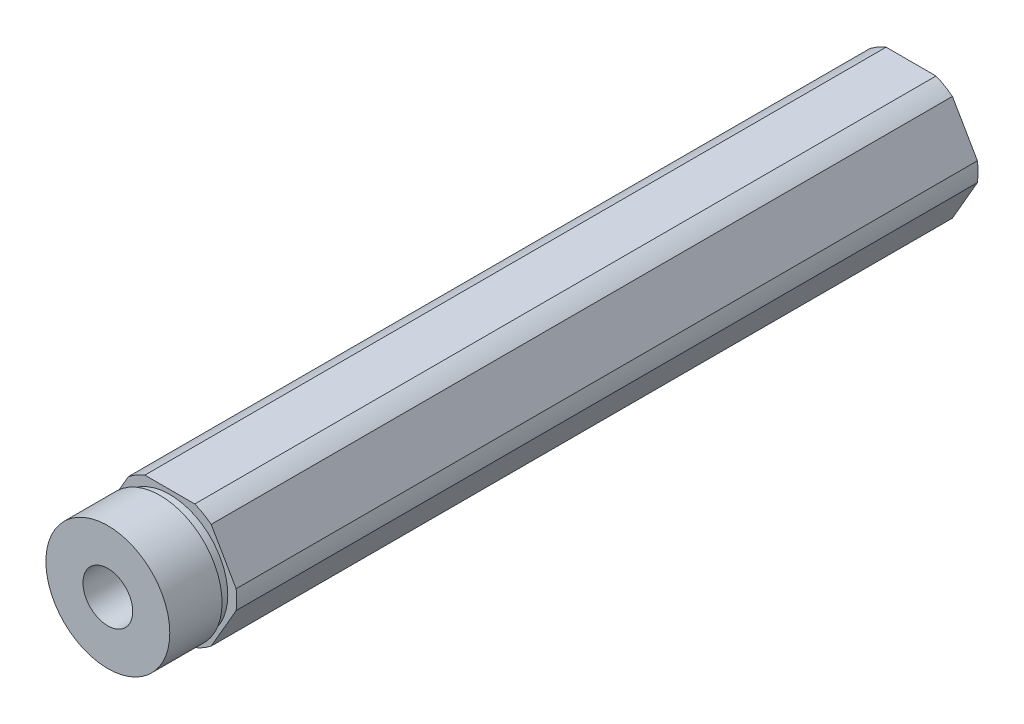
ISO-10303-21;
HEADER;
FILE_DESCRIPTION(('STEP AP214'),'2;1');
FILE_NAME('part.step','',(''),(''),'','','');
FILE_SCHEMA(('AUTOMOTIVE_DESIGN { 1 0 10303 214 1 1 1 1 }'));
ENDSEC;
DATA;
#1=APPLICATION_CONTEXT('core data for automotive mechanical design processes');
#2=APPLICATION_PROTOCOL_DEFINITION('international standard','automotive_design',2000,#1);
#3=PRODUCT_CONTEXT('',#1,'mechanical');
#4=PRODUCT('Part','Part','',(#3));
#5=PRODUCT_RELATED_PRODUCT_CATEGORY('part','',(#4));
#6=PRODUCT_DEFINITION_FORMATION('','',#4);
#7=PRODUCT_DEFINITION_CONTEXT('part definition',#1,'design');
#8=PRODUCT_DEFINITION('design','',#6,#7);
#9=PRODUCT_DEFINITION_SHAPE('','',#8);
#10=(LENGTH_UNIT() NAMED_UNIT(*) SI_UNIT(.MILLI.,.METRE.));
#11=(NAMED_UNIT(*) PLANE_ANGLE_UNIT() SI_UNIT($,.RADIAN.));
#12=(NAMED_UNIT(*) SI_UNIT($,.STERADIAN.) SOLID_ANGLE_UNIT());
#13=UNCERTAINTY_MEASURE_WITH_UNIT(LENGTH_MEASURE(1.E-05),#10,'distance_accuracy_value','');
#14=(GEOMETRIC_REPRESENTATION_CONTEXT(3) GLOBAL_UNCERTAINTY_ASSIGNED_CONTEXT((#13)) GLOBAL_UNIT_ASSIGNED_CONTEXT((#10,
#11,#12)) REPRESENTATION_CONTEXT('',''));
#15=CARTESIAN_POINT('',(0.,0.,0.));
#16=DIRECTION('',(0.,0.,1.));
#17=DIRECTION('',(1.,0.,0.));
#18=AXIS2_PLACEMENT_3D('',#15,#16,#17);
#19=CARTESIAN_POINT('',(0.,0.,-228.6));
#20=DIRECTION('',(0.,0.,1.));
#21=DIRECTION('',(1.,0.,0.));
#22=AXIS2_PLACEMENT_3D('',#19,#20,#21);
#23=CYLINDRICAL_SURFACE('',#22,6.87);
#24=DIRECTION('',(0.,0.,1.));
#25=VECTOR('',#24,1.);
#26=CARTESIAN_POINT('',(6.80102150534208,0.97108520937895,228.6));
#27=LINE('',#26,#25);
#28=CARTESIAN_POINT('',(6.80102150534208,0.971085209378948,-228.6));
#29=VERTEX_POINT('',#28);
#30=CARTESIAN_POINT('',(6.80102150534208,0.971085209378948,-152.62225));
#31=VERTEX_POINT('',#30);
#32=EDGE_CURVE('E181',#29,#31,#27,.T.);
#33=ORIENTED_EDGE('',*,*,#32,.T.);
#34=CARTESIAN_POINT('',(0.,0.,-152.62225));
#35=DIRECTION('',(0.,0.,1.));
#36=DIRECTION('',(1.,0.,0.));
#37=AXIS2_PLACEMENT_3D('',#34,#35,#36);
#38=CIRCLE('',#37,6.87);
#39=CARTESIAN_POINT('',(6.80102150534208,-0.971085209378954,-152.62225));
#40=VERTEX_POINT('',#39);
#41=EDGE_CURVE('E124',#31,#40,#38,.F.);
#42=ORIENTED_EDGE('',*,*,#41,.T.);
#43=DIRECTION('',(0.,0.,1.));
#44=VECTOR('',#43,1.);
#45=CARTESIAN_POINT('',(6.80102150534208,-0.971085209378955,228.6));
#46=LINE('',#45,#44);
#47=CARTESIAN_POINT('',(6.80102150534208,-0.971085209378953,-228.6));
#48=VERTEX_POINT('',#47);
#49=EDGE_CURVE('E118',#40,#48,#46,.F.);
#50=ORIENTED_EDGE('',*,*,#49,.T.);
#51=CARTESIAN_POINT('',(0.,0.,-228.6));
#52=DIRECTION('',(0.,0.,1.));
#53=DIRECTION('',(1.,0.,0.));
#54=AXIS2_PLACEMENT_3D('',#51,#52,#53);
#55=CIRCLE('',#54,6.87);
#56=EDGE_CURVE('E121',#48,#29,#55,.T.);
#57=ORIENTED_EDGE('',*,*,#56,.T.);
#58=EDGE_LOOP('',(#33,#42,#50,#57));
#59=FACE_BOUND('',#58,.T.);
#60=ADVANCED_FACE('F43',(#59),#23,.T.);
#61=CARTESIAN_POINT('',(3.68083890619154,6.3754,228.6));
#62=DIRECTION('',(0.,-1.,0.));
#63=DIRECTION('',(1.,0.,0.));
#64=AXIS2_PLACEMENT_3D('',#61,#62,#63);
#65=PLANE('',#64);
#66=DIRECTION('',(-1.,0.,0.));
#67=VECTOR('',#66,1.);
#68=CARTESIAN_POINT('',(3.68083890619154,6.3754,-152.62225));
#69=LINE('',#68,#67);
#70=CARTESIAN_POINT('',(2.55952629210953,6.37540000000001,-152.62225));
#71=VERTEX_POINT('',#70);
#72=CARTESIAN_POINT('',(-2.55952629210953,6.3754,-152.62225));
#73=VERTEX_POINT('',#72);
#74=EDGE_CURVE('E300',#71,#73,#69,.T.);
#75=ORIENTED_EDGE('',*,*,#74,.F.);
#76=DIRECTION('',(0.,0.,1.));
#77=VECTOR('',#76,1.);
#78=CARTESIAN_POINT('',(2.55952629210953,6.37540000000001,-228.6));
#79=LINE('',#78,#77);
#80=CARTESIAN_POINT('',(2.55952629210953,6.37540000000001,-228.6));
#81=VERTEX_POINT('',#80);
#82=EDGE_CURVE('E178',#81,#71,#79,.T.);
#83=ORIENTED_EDGE('',*,*,#82,.F.);
#84=DIRECTION('',(1.,0.,0.));
#85=VECTOR('',#84,1.);
#86=CARTESIAN_POINT('',(0.,6.3754,-228.6));
#87=LINE('',#86,#85);
#88=CARTESIAN_POINT('',(-2.55952629210953,6.37540000000001,-228.6));
#89=VERTEX_POINT('',#88);
#90=EDGE_CURVE('E174',#81,#89,#87,.F.);
#91=ORIENTED_EDGE('',*,*,#90,.T.);
#92=DIRECTION('',(0.,0.,1.));
#93=VECTOR('',#92,1.);
#94=CARTESIAN_POINT('',(-2.55952629210953,6.37540000000001,-228.6));
#95=LINE('',#94,#93);
#96=EDGE_CURVE('E143',#73,#89,#95,.F.);
#97=ORIENTED_EDGE('',*,*,#96,.F.);
#98=EDGE_LOOP('',(#75,#83,#91,#97));
#99=FACE_BOUND('',#98,.T.);
#100=ADVANCED_FACE('F247',(#99),#65,.F.);
#101=CARTESIAN_POINT('',(0.,0.,-228.6));
#102=DIRECTION('',(0.,0.,1.));
#103=DIRECTION('',(1.,0.,0.));
#104=AXIS2_PLACEMENT_3D('',#101,#102,#103);
#105=CYLINDRICAL_SURFACE('',#104,6.87);
#106=DIRECTION('',(0.,0.,1.));
#107=VECTOR('',#106,1.);
#108=CARTESIAN_POINT('',(-4.24149521323255,5.40431479062104,228.6));
#109=LINE('',#108,#107);
#110=CARTESIAN_POINT('',(-4.24149521323255,5.40431479062105,-228.6));
#111=VERTEX_POINT('',#110);
#112=CARTESIAN_POINT('',(-4.24149521323255,5.40431479062104,-152.62225));
#113=VERTEX_POINT('',#112);
#114=EDGE_CURVE('E204',#111,#113,#109,.T.);
#115=ORIENTED_EDGE('',*,*,#114,.T.);
#116=CARTESIAN_POINT('',(0.,0.,-152.62225));
#117=DIRECTION('',(0.,0.,1.));
#118=DIRECTION('',(1.,0.,0.));
#119=AXIS2_PLACEMENT_3D('',#116,#117,#118);
#120=CIRCLE('',#119,6.87);
#121=EDGE_CURVE('E144',#113,#73,#120,.F.);
#122=ORIENTED_EDGE('',*,*,#121,.T.);
#123=ORIENTED_EDGE('',*,*,#96,.T.);
#124=CARTESIAN_POINT('',(0.,0.,-228.6));
#125=DIRECTION('',(0.,0.,1.));
#126=DIRECTION('',(1.,0.,0.));
#127=AXIS2_PLACEMENT_3D('',#124,#125,#126);
#128=CIRCLE('',#127,6.87);
#129=EDGE_CURVE('E173',#89,#111,#128,.T.);
#130=ORIENTED_EDGE('',*,*,#129,.T.);
#131=EDGE_LOOP('',(#115,#122,#123,#130));
#132=FACE_BOUND('',#131,.T.);
#133=ADVANCED_FACE('F251',(#132),#105,.T.);
#134=CARTESIAN_POINT('',(-3.68083890619154,6.3754,228.6));
#135=DIRECTION('',(0.866025403784439,-0.5,0.));
#136=DIRECTION('',(0.5,0.866025403784439,0.));
#137=AXIS2_PLACEMENT_3D('',#134,#135,#136);
#138=PLANE('',#137);
#139=DIRECTION('',(-0.5,-0.866025403784439,0.));
#140=VECTOR('',#139,1.);
#141=CARTESIAN_POINT('',(-3.68083890619154,6.3754,-152.62225));
#142=LINE('',#141,#140);
#143=CARTESIAN_POINT('',(-6.80102150534208,0.971085209378959,-152.62225));
#144=VERTEX_POINT('',#143);
#145=EDGE_CURVE('E337',#113,#144,#142,.T.);
#146=ORIENTED_EDGE('',*,*,#145,.F.);
#147=ORIENTED_EDGE('',*,*,#114,.F.);
#148=DIRECTION('',(-0.5,-0.866025403784439,0.));
#149=VECTOR('',#148,1.);
#150=CARTESIAN_POINT('',(-4.24149521323255,5.40431479062104,-228.6));
#151=LINE('',#150,#149);
#152=CARTESIAN_POINT('',(-6.80102150534208,0.971085209378961,-228.6));
#153=VERTEX_POINT('',#152);
#154=EDGE_CURVE('E169',#111,#153,#151,.T.);
#155=ORIENTED_EDGE('',*,*,#154,.T.);
#156=DIRECTION('',(0.,0.,1.));
#157=VECTOR('',#156,1.);
#158=CARTESIAN_POINT('',(-6.80102150534208,0.971085209378959,-228.6));
#159=LINE('',#158,#157);
#160=EDGE_CURVE('E202',#144,#153,#159,.F.);
#161=ORIENTED_EDGE('',*,*,#160,.F.);
#162=EDGE_LOOP('',(#146,#147,#155,#161));
#163=FACE_BOUND('',#162,.T.);
#164=ADVANCED_FACE('F256',(#163),#138,.F.);
#165=CARTESIAN_POINT('',(0.,0.,-228.6));
#166=DIRECTION('',(0.,0.,1.));
#167=DIRECTION('',(1.,0.,0.));
#168=AXIS2_PLACEMENT_3D('',#165,#166,#167);
#169=CYLINDRICAL_SURFACE('',#168,6.87);
#170=DIRECTION('',(0.,0.,1.));
#171=VECTOR('',#170,1.);
#172=CARTESIAN_POINT('',(-6.80102150534208,-0.971085209378956,228.6));
#173=LINE('',#172,#171);
#174=CARTESIAN_POINT('',(-6.80102150534208,-0.971085209378956,-228.6));
#175=VERTEX_POINT('',#174);
#176=CARTESIAN_POINT('',(-6.80102150534208,-0.971085209378956,-152.62225));
#177=VERTEX_POINT('',#176);
#178=EDGE_CURVE('E198',#175,#177,#173,.T.);
#179=ORIENTED_EDGE('',*,*,#178,.T.);
#180=CARTESIAN_POINT('',(0.,0.,-152.62225));
#181=DIRECTION('',(0.,0.,1.));
#182=DIRECTION('',(1.,0.,0.));
#183=AXIS2_PLACEMENT_3D('',#180,#181,#182);
#184=CIRCLE('',#183,6.87);
#185=EDGE_CURVE('E333',#177,#144,#184,.F.);
#186=ORIENTED_EDGE('',*,*,#185,.T.);
#187=ORIENTED_EDGE('',*,*,#160,.T.);
#188=CARTESIAN_POINT('',(0.,0.,-228.6));
#189=DIRECTION('',(0.,0.,1.));
#190=DIRECTION('',(1.,0.,0.));
#191=AXIS2_PLACEMENT_3D('',#188,#189,#190);
#192=CIRCLE('',#191,6.87);
#193=EDGE_CURVE('E168',#153,#175,#192,.T.);
#194=ORIENTED_EDGE('',*,*,#193,.T.);
#195=EDGE_LOOP('',(#179,#186,#187,#194));
#196=FACE_BOUND('',#195,.T.);
#197=ADVANCED_FACE('F263',(#196),#169,.T.);
#198=CARTESIAN_POINT('',(-7.36167781238308,0.,228.6));
#199=DIRECTION('',(0.866025403784439,0.5,0.));
#200=DIRECTION('',(-0.5,0.866025403784439,0.));
#201=AXIS2_PLACEMENT_3D('',#198,#199,#200);
#202=PLANE('',#201);
#203=DIRECTION('',(0.5,-0.866025403784439,0.));
#204=VECTOR('',#203,1.);
#205=CARTESIAN_POINT('',(-7.36167781238308,0.,-152.62225));
#206=LINE('',#205,#204);
#207=CARTESIAN_POINT('',(-4.24149521323255,-5.40431479062105,-152.62225));
#208=VERTEX_POINT('',#207);
#209=EDGE_CURVE('E329',#177,#208,#206,.T.);
#210=ORIENTED_EDGE('',*,*,#209,.F.);
#211=ORIENTED_EDGE('',*,*,#178,.F.);
#212=DIRECTION('',(0.5,-0.866025403784438,0.));
#213=VECTOR('',#212,1.);
#214=CARTESIAN_POINT('',(-6.80102150534208,-0.971085209378956,-228.6));
#215=LINE('',#214,#213);
#216=CARTESIAN_POINT('',(-4.24149521323254,-5.40431479062105,-228.6));
#217=VERTEX_POINT('',#216);
#218=EDGE_CURVE('E165',#175,#217,#215,.T.);
#219=ORIENTED_EDGE('',*,*,#218,.T.);
#220=DIRECTION('',(0.,0.,1.));
#221=VECTOR('',#220,1.);
#222=CARTESIAN_POINT('',(-4.24149521323255,-5.40431479062105,-228.6));
#223=LINE('',#222,#221);
#224=EDGE_CURVE('E195',#208,#217,#223,.F.);
#225=ORIENTED_EDGE('',*,*,#224,.F.);
#226=EDGE_LOOP('',(#210,#211,#219,#225));
#227=FACE_BOUND('',#226,.T.);
#228=ADVANCED_FACE('F267',(#227),#202,.F.);
#229=CARTESIAN_POINT('',(0.,0.,-228.6));
#230=DIRECTION('',(0.,0.,1.));
#231=DIRECTION('',(1.,0.,0.));
#232=AXIS2_PLACEMENT_3D('',#229,#230,#231);
#233=CYLINDRICAL_SURFACE('',#232,6.87);
#234=DIRECTION('',(0.,0.,1.));
#235=VECTOR('',#234,1.);
#236=CARTESIAN_POINT('',(-2.55952629210953,-6.3754,228.6));
#237=LINE('',#236,#235);
#238=CARTESIAN_POINT('',(-2.55952629210953,-6.3754,-228.6));
#239=VERTEX_POINT('',#238);
#240=CARTESIAN_POINT('',(-2.55952629210953,-6.3754,-152.62225));
#241=VERTEX_POINT('',#240);
#242=EDGE_CURVE('E191',#239,#241,#237,.T.);
#243=ORIENTED_EDGE('',*,*,#242,.T.);
#244=CARTESIAN_POINT('',(0.,0.,-152.62225));
#245=DIRECTION('',(0.,0.,1.));
#246=DIRECTION('',(1.,0.,0.));
#247=AXIS2_PLACEMENT_3D('',#244,#245,#246);
#248=CIRCLE('',#247,6.87);
#249=EDGE_CURVE('E325',#241,#208,#248,.F.);
#250=ORIENTED_EDGE('',*,*,#249,.T.);
#251=ORIENTED_EDGE('',*,*,#224,.T.);
#252=CARTESIAN_POINT('',(0.,0.,-228.6));
#253=DIRECTION('',(0.,0.,1.));
#254=DIRECTION('',(1.,0.,0.));
#255=AXIS2_PLACEMENT_3D('',#252,#253,#254);
#256=CIRCLE('',#255,6.87);
#257=EDGE_CURVE('E164',#217,#239,#256,.T.);
#258=ORIENTED_EDGE('',*,*,#257,.T.);
#259=EDGE_LOOP('',(#243,#250,#251,#258));
#260=FACE_BOUND('',#259,.T.);
#261=ADVANCED_FACE('F271',(#260),#233,.T.);
#262=CARTESIAN_POINT('',(-3.68083890619154,-6.3754,228.6));
#263=DIRECTION('',(0.,1.,0.));
#264=DIRECTION('',(0.,0.,1.));
#265=AXIS2_PLACEMENT_3D('',#262,#263,#264);
#266=PLANE('',#265);
#267=DIRECTION('',(1.,0.,0.));
#268=VECTOR('',#267,1.);
#269=CARTESIAN_POINT('',(-3.68083890619154,-6.3754,-152.62225));
#270=LINE('',#269,#268);
#271=CARTESIAN_POINT('',(2.55952629210953,-6.37540000000001,-152.62225));
#272=VERTEX_POINT('',#271);
#273=EDGE_CURVE('E321',#241,#272,#270,.T.);
#274=ORIENTED_EDGE('',*,*,#273,.F.);
#275=ORIENTED_EDGE('',*,*,#242,.F.);
#276=DIRECTION('',(1.,0.,0.));
#277=VECTOR('',#276,1.);
#278=CARTESIAN_POINT('',(0.,-6.3754,-228.6));
#279=LINE('',#278,#277);
#280=CARTESIAN_POINT('',(2.55952629210953,-6.3754,-228.6));
#281=VERTEX_POINT('',#280);
#282=EDGE_CURVE('E157',#239,#281,#279,.T.);
#283=ORIENTED_EDGE('',*,*,#282,.T.);
#284=DIRECTION('',(0.,0.,1.));
#285=VECTOR('',#284,1.);
#286=CARTESIAN_POINT('',(2.55952629210953,-6.3754,-228.6));
#287=LINE('',#286,#285);
#288=EDGE_CURVE('E130',#272,#281,#287,.F.);
#289=ORIENTED_EDGE('',*,*,#288,.F.);
#290=EDGE_LOOP('',(#274,#275,#283,#289));
#291=FACE_BOUND('',#290,.T.);
#292=ADVANCED_FACE('F275',(#291),#266,.F.);
#293=CARTESIAN_POINT('',(0.,0.,-228.6));
#294=DIRECTION('',(0.,0.,1.));
#295=DIRECTION('',(1.,0.,0.));
#296=AXIS2_PLACEMENT_3D('',#293,#294,#295);
#297=CYLINDRICAL_SURFACE('',#296,6.87);
#298=DIRECTION('',(0.,0.,1.));
#299=VECTOR('',#298,1.);
#300=CARTESIAN_POINT('',(4.24149521323254,-5.40431479062105,228.6));
#301=LINE('',#300,#299);
#302=CARTESIAN_POINT('',(4.24149521323254,-5.40431479062105,-228.6));
#303=VERTEX_POINT('',#302);
#304=CARTESIAN_POINT('',(4.24149521323254,-5.40431479062105,-152.62225));
#305=VERTEX_POINT('',#304);
#306=EDGE_CURVE('E129',#303,#305,#301,.T.);
#307=ORIENTED_EDGE('',*,*,#306,.T.);
#308=CARTESIAN_POINT('',(0.,0.,-152.62225));
#309=DIRECTION('',(0.,0.,1.));
#310=DIRECTION('',(1.,0.,0.));
#311=AXIS2_PLACEMENT_3D('',#308,#309,#310);
#312=CIRCLE('',#311,6.87);
#313=EDGE_CURVE('E317',#305,#272,#312,.F.);
#314=ORIENTED_EDGE('',*,*,#313,.T.);
#315=ORIENTED_EDGE('',*,*,#288,.T.);
#316=CARTESIAN_POINT('',(0.,0.,-228.6));
#317=DIRECTION('',(0.,0.,1.));
#318=DIRECTION('',(1.,0.,0.));
#319=AXIS2_PLACEMENT_3D('',#316,#317,#318);
#320=CIRCLE('',#319,6.87);
#321=EDGE_CURVE('E149',#281,#303,#320,.T.);
#322=ORIENTED_EDGE('',*,*,#321,.T.);
#323=EDGE_LOOP('',(#307,#314,#315,#322));
#324=FACE_BOUND('',#323,.T.);
#325=ADVANCED_FACE('F279',(#324),#297,.T.);
#326=CARTESIAN_POINT('',(3.68083890619154,-6.3754,228.6));
#327=DIRECTION('',(-0.866025403784439,0.5,0.));
#328=DIRECTION('',(-0.5,-0.866025403784439,0.));
#329=AXIS2_PLACEMENT_3D('',#326,#327,#328);
#330=PLANE('',#329);
#331=DIRECTION('',(0.5,0.866025403784439,0.));
#332=VECTOR('',#331,1.);
#333=CARTESIAN_POINT('',(3.68083890619154,-6.3754,-152.62225));
#334=LINE('',#333,#332);
#335=EDGE_CURVE('E308',#305,#40,#334,.T.);
#336=ORIENTED_EDGE('',*,*,#335,.F.);
#337=ORIENTED_EDGE('',*,*,#306,.F.);
#338=DIRECTION('',(0.5,0.866025403784439,0.));
#339=VECTOR('',#338,1.);
#340=CARTESIAN_POINT('',(4.24149521323254,-5.40431479062105,-228.6));
#341=LINE('',#340,#339);
#342=EDGE_CURVE('E138',#303,#48,#341,.T.);
#343=ORIENTED_EDGE('',*,*,#342,.T.);
#344=ORIENTED_EDGE('',*,*,#49,.F.);
#345=EDGE_LOOP('',(#336,#337,#343,#344));
#346=FACE_BOUND('',#345,.T.);
#347=ADVANCED_FACE('F146',(#346),#330,.F.);
#348=CARTESIAN_POINT('',(7.36167781238308,0.,228.6));
#349=DIRECTION('',(-0.866025403784439,-0.5,0.));
#350=DIRECTION('',(0.5,-0.866025403784439,0.));
#351=AXIS2_PLACEMENT_3D('',#348,#349,#350);
#352=PLANE('',#351);
#353=DIRECTION('',(-0.5,0.866025403784439,0.));
#354=VECTOR('',#353,1.);
#355=CARTESIAN_POINT('',(7.36167781238308,0.,-152.62225));
#356=LINE('',#355,#354);
#357=CARTESIAN_POINT('',(4.24149521323254,5.40431479062105,-152.62225));
#358=VERTEX_POINT('',#357);
#359=EDGE_CURVE('E61',#31,#358,#356,.T.);
#360=ORIENTED_EDGE('',*,*,#359,.F.);
#361=ORIENTED_EDGE('',*,*,#32,.F.);
#362=DIRECTION('',(-0.5,0.866025403784438,0.));
#363=VECTOR('',#362,1.);
#364=CARTESIAN_POINT('',(6.80102150534208,0.97108520937895,-228.6));
#365=LINE('',#364,#363);
#366=CARTESIAN_POINT('',(4.24149521323254,5.40431479062105,-228.6));
#367=VERTEX_POINT('',#366);
#368=EDGE_CURVE('E141',#29,#367,#365,.T.);
#369=ORIENTED_EDGE('',*,*,#368,.T.);
#370=DIRECTION('',(0.,0.,1.));
#371=VECTOR('',#370,1.);
#372=CARTESIAN_POINT('',(4.24149521323254,5.40431479062105,-228.6));
#373=LINE('',#372,#371);
#374=EDGE_CURVE('E69',#358,#367,#373,.F.);
#375=ORIENTED_EDGE('',*,*,#374,.F.);
#376=EDGE_LOOP('',(#360,#361,#369,#375));
#377=FACE_BOUND('',#376,.T.);
#378=ADVANCED_FACE('F286',(#377),#352,.F.);
#379=CARTESIAN_POINT('',(0.,0.,-228.6));
#380=DIRECTION('',(0.,0.,1.));
#381=DIRECTION('',(1.,0.,0.));
#382=AXIS2_PLACEMENT_3D('',#379,#380,#381);
#383=CYLINDRICAL_SURFACE('',#382,6.87);
#384=ORIENTED_EDGE('',*,*,#82,.T.);
#385=CARTESIAN_POINT('',(0.,0.,-152.62225));
#386=DIRECTION('',(0.,0.,1.));
#387=DIRECTION('',(1.,0.,0.));
#388=AXIS2_PLACEMENT_3D('',#385,#386,#387);
#389=CIRCLE('',#388,6.87);
#390=EDGE_CURVE('E12',#71,#358,#389,.F.);
#391=ORIENTED_EDGE('',*,*,#390,.T.);
#392=ORIENTED_EDGE('',*,*,#374,.T.);
#393=CARTESIAN_POINT('',(0.,0.,-228.6));
#394=DIRECTION('',(0.,0.,1.));
#395=DIRECTION('',(1.,0.,0.));
#396=AXIS2_PLACEMENT_3D('',#393,#394,#395);
#397=CIRCLE('',#396,6.87);
#398=EDGE_CURVE('E154',#367,#81,#397,.T.);
#399=ORIENTED_EDGE('',*,*,#398,.T.);
#400=EDGE_LOOP('',(#384,#391,#392,#399));
#401=FACE_BOUND('',#400,.T.);
#402=ADVANCED_FACE('F243',(#401),#383,.T.);
#403=CARTESIAN_POINT('',(0.,0.,-146.27225));
#404=DIRECTION('',(0.,0.,1.));
#405=DIRECTION('',(1.,0.,0.));
#406=AXIS2_PLACEMENT_3D('',#403,#404,#405);
#407=PLANE('',#406);
#408=CARTESIAN_POINT('',(0.,0.,-146.27225));
#409=DIRECTION('',(0.,0.,1.));
#410=DIRECTION('',(1.,0.,0.));
#411=AXIS2_PLACEMENT_3D('',#408,#409,#410);
#412=CIRCLE('',#411,2.55);
#413=CARTESIAN_POINT('',(2.55,0.,-146.27225));
#414=VERTEX_POINT('',#413);
#415=EDGE_CURVE('E51',#414,#414,#412,.F.);
#416=ORIENTED_EDGE('',*,*,#415,.T.);
#417=EDGE_LOOP('',(#416));
#418=FACE_BOUND('',#417,.T.);
#419=CARTESIAN_POINT('',(0.,0.,-146.27225));
#420=DIRECTION('',(0.,0.,1.));
#421=DIRECTION('',(1.,0.,0.));
#422=AXIS2_PLACEMENT_3D('',#419,#420,#421);
#423=CIRCLE('',#422,6.35);
#424=CARTESIAN_POINT('',(6.35,0.,-146.27225));
#425=VERTEX_POINT('',#424);
#426=EDGE_CURVE('E395',#425,#425,#423,.T.);
#427=ORIENTED_EDGE('',*,*,#426,.T.);
#428=EDGE_LOOP('',(#427));
#429=FACE_BOUND('',#428,.T.);
#430=ADVANCED_FACE('F230',(#418,#429),#407,.T.);
#431=CARTESIAN_POINT('',(0.,0.,-228.6));
#432=DIRECTION('',(0.,0.,1.));
#433=DIRECTION('',(1.,0.,0.));
#434=AXIS2_PLACEMENT_3D('',#431,#432,#433);
#435=CYLINDRICAL_SURFACE('',#434,2.55);
#436=CARTESIAN_POINT('',(0.,0.,-228.6));
#437=DIRECTION('',(0.,0.,1.));
#438=DIRECTION('',(1.,0.,0.));
#439=AXIS2_PLACEMENT_3D('',#436,#437,#438);
#440=CIRCLE('',#439,2.55);
#441=CARTESIAN_POINT('',(2.55,0.,-228.6));
#442=VERTEX_POINT('',#441);
#443=EDGE_CURVE('E210',#442,#442,#440,.T.);
#444=ORIENTED_EDGE('',*,*,#443,.F.);
#445=EDGE_LOOP('',(#444));
#446=FACE_BOUND('',#445,.T.);
#447=ORIENTED_EDGE('',*,*,#415,.F.);
#448=EDGE_LOOP('',(#447));
#449=FACE_BOUND('',#448,.T.);
#450=ADVANCED_FACE('F233',(#446,#449),#435,.F.);
#451=CARTESIAN_POINT('',(0.,0.,-228.6));
#452=DIRECTION('',(0.,0.,1.));
#453=DIRECTION('',(1.,0.,0.));
#454=AXIS2_PLACEMENT_3D('',#451,#452,#453);
#455=PLANE('',#454);
#456=ORIENTED_EDGE('',*,*,#368,.F.);
#457=ORIENTED_EDGE('',*,*,#56,.F.);
#458=ORIENTED_EDGE('',*,*,#342,.F.);
#459=ORIENTED_EDGE('',*,*,#321,.F.);
#460=ORIENTED_EDGE('',*,*,#282,.F.);
#461=ORIENTED_EDGE('',*,*,#257,.F.);
#462=ORIENTED_EDGE('',*,*,#218,.F.);
#463=ORIENTED_EDGE('',*,*,#193,.F.);
#464=ORIENTED_EDGE('',*,*,#154,.F.);
#465=ORIENTED_EDGE('',*,*,#129,.F.);
#466=ORIENTED_EDGE('',*,*,#90,.F.);
#467=ORIENTED_EDGE('',*,*,#398,.F.);
#468=EDGE_LOOP('',(#456,#457,#458,#459,#460,#461,#462,#463,#464,#465,#466,#467));
#469=FACE_BOUND('',#468,.T.);
#470=ORIENTED_EDGE('',*,*,#443,.T.);
#471=EDGE_LOOP('',(#470));
#472=FACE_BOUND('',#471,.T.);
#473=ADVANCED_FACE('F135',(#469,#472),#455,.F.);
#474=CARTESIAN_POINT('',(0.,10.6805397085514,-152.62225));
#475=DIRECTION('',(0.,0.,1.));
#476=DIRECTION('',(1.,0.,0.));
#477=AXIS2_PLACEMENT_3D('',#474,#475,#476);
#478=PLANE('',#477);
#479=ORIENTED_EDGE('',*,*,#145,.T.);
#480=ORIENTED_EDGE('',*,*,#185,.F.);
#481=ORIENTED_EDGE('',*,*,#209,.T.);
#482=ORIENTED_EDGE('',*,*,#249,.F.);
#483=ORIENTED_EDGE('',*,*,#273,.T.);
#484=ORIENTED_EDGE('',*,*,#313,.F.);
#485=ORIENTED_EDGE('',*,*,#335,.T.);
#486=ORIENTED_EDGE('',*,*,#41,.F.);
#487=ORIENTED_EDGE('',*,*,#359,.T.);
#488=ORIENTED_EDGE('',*,*,#390,.F.);
#489=ORIENTED_EDGE('',*,*,#74,.T.);
#490=ORIENTED_EDGE('',*,*,#121,.F.);
#491=EDGE_LOOP('',(#479,#480,#481,#482,#483,#484,#485,#486,#487,#488,#489,#490));
#492=FACE_BOUND('',#491,.T.);
#493=CARTESIAN_POINT('',(0.,0.,-152.62225));
#494=DIRECTION('',(0.,0.,1.));
#495=DIRECTION('',(1.,0.,0.));
#496=AXIS2_PLACEMENT_3D('',#493,#494,#495);
#497=CIRCLE('',#496,5.9436);
#498=CARTESIAN_POINT('',(5.9436,0.,-152.62225));
#499=VERTEX_POINT('',#498);
#500=EDGE_CURVE('E310',#499,#499,#497,.T.);
#501=ORIENTED_EDGE('',*,*,#500,.F.);
#502=EDGE_LOOP('',(#501));
#503=FACE_BOUND('',#502,.T.);
#504=ADVANCED_FACE('F241',(#492,#503),#478,.T.);
#505=CARTESIAN_POINT('',(0.,0.,0.));
#506=DIRECTION('',(0.,0.,1.));
#507=DIRECTION('',(1.,0.,0.));
#508=AXIS2_PLACEMENT_3D('',#505,#506,#507);
#509=CYLINDRICAL_SURFACE('',#508,5.9436);
#510=ORIENTED_EDGE('',*,*,#500,.T.);
#511=EDGE_LOOP('',(#510));
#512=FACE_BOUND('',#511,.T.);
#513=CARTESIAN_POINT('',(0.,0.,-151.63165));
#514=DIRECTION('',(0.,0.,1.));
#515=DIRECTION('',(1.,0.,0.));
#516=AXIS2_PLACEMENT_3D('',#513,#514,#515);
#517=CIRCLE('',#516,5.9436);
#518=CARTESIAN_POINT('',(5.9436,0.,-151.63165));
#519=VERTEX_POINT('',#518);
#520=EDGE_CURVE('E387',#519,#519,#517,.T.);
#521=ORIENTED_EDGE('',*,*,#520,.F.);
#522=EDGE_LOOP('',(#521));
#523=FACE_BOUND('',#522,.T.);
#524=ADVANCED_FACE('F382',(#512,#523),#509,.T.);
#525=CARTESIAN_POINT('',(0.,5.9436,-151.63165));
#526=DIRECTION('',(0.,0.,-1.));
#527=DIRECTION('',(-1.,0.,0.));
#528=AXIS2_PLACEMENT_3D('',#525,#526,#527);
#529=PLANE('',#528);
#530=ORIENTED_EDGE('',*,*,#520,.T.);
#531=EDGE_LOOP('',(#530));
#532=FACE_BOUND('',#531,.T.);
#533=CARTESIAN_POINT('',(0.,0.,-151.63165));
#534=DIRECTION('',(0.,0.,1.));
#535=DIRECTION('',(1.,0.,0.));
#536=AXIS2_PLACEMENT_3D('',#533,#534,#535);
#537=CIRCLE('',#536,6.35);
#538=CARTESIAN_POINT('',(6.35,0.,-151.63165));
#539=VERTEX_POINT('',#538);
#540=EDGE_CURVE('E390',#539,#539,#537,.T.);
#541=ORIENTED_EDGE('',*,*,#540,.F.);
#542=EDGE_LOOP('',(#541));
#543=FACE_BOUND('',#542,.T.);
#544=ADVANCED_FACE('F401',(#532,#543),#529,.T.);
#545=CARTESIAN_POINT('',(0.,0.,0.));
#546=DIRECTION('',(0.,0.,1.));
#547=DIRECTION('',(1.,0.,0.));
#548=AXIS2_PLACEMENT_3D('',#545,#546,#547);
#549=CYLINDRICAL_SURFACE('',#548,6.35);
#550=ORIENTED_EDGE('',*,*,#540,.T.);
#551=EDGE_LOOP('',(#550));
#552=FACE_BOUND('',#551,.T.);
#553=ORIENTED_EDGE('',*,*,#426,.F.);
#554=EDGE_LOOP('',(#553));
#555=FACE_BOUND('',#554,.T.);
#556=ADVANCED_FACE('F399',(#552,#555),#549,.T.);
#557=CLOSED_SHELL('',(#60,#100,#133,#164,#197,#228,#261,#292,#325,#347,#378,#402,#430,#450,#473,
#504,#524,#544,#556));
#558=MANIFOLD_SOLID_BREP('B2',#557);
#559=ADVANCED_BREP_SHAPE_REPRESENTATION('',(#18,#558),#14);
#560=SHAPE_DEFINITION_REPRESENTATION(#9,#559);
ENDSEC;
END-ISO-10303-21;
